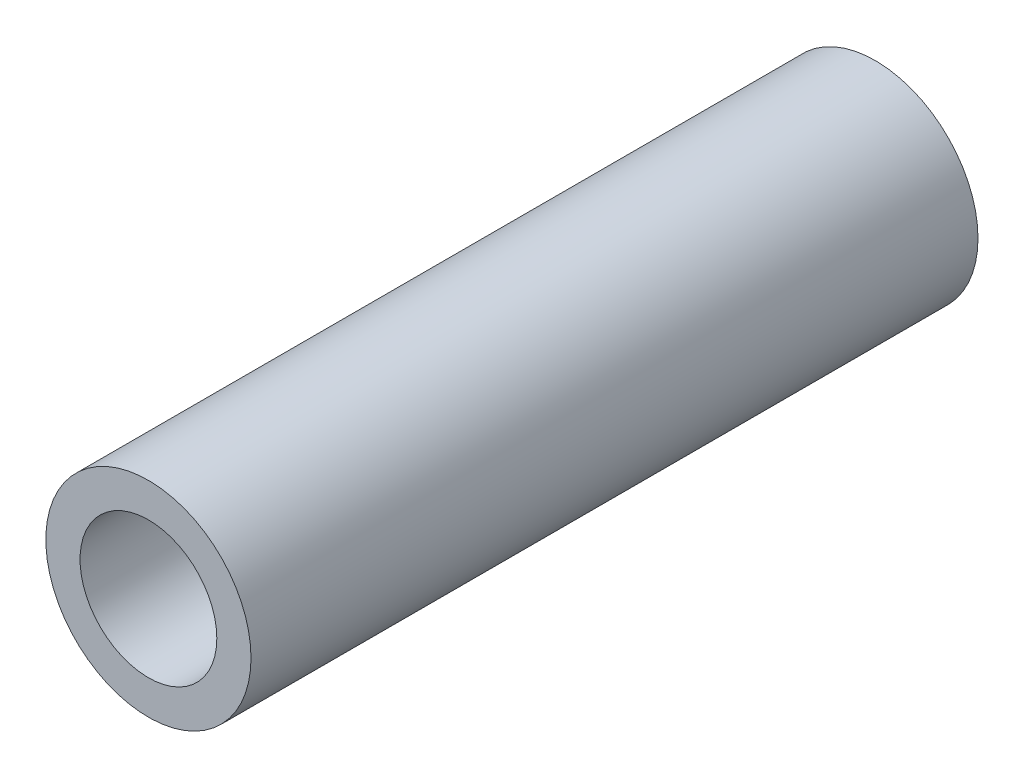
ISO-10303-21;
HEADER;
FILE_DESCRIPTION(('STEP AP214'),'2;1');
FILE_NAME('part.step','',(''),(''),'','','');
FILE_SCHEMA(('AUTOMOTIVE_DESIGN { 1 0 10303 214 1 1 1 1 }'));
ENDSEC;
DATA;
#1=APPLICATION_CONTEXT('core data for automotive mechanical design processes');
#2=APPLICATION_PROTOCOL_DEFINITION('international standard','automotive_design',2000,#1);
#3=PRODUCT_CONTEXT('',#1,'mechanical');
#4=PRODUCT('Part','Part','',(#3));
#5=PRODUCT_RELATED_PRODUCT_CATEGORY('part','',(#4));
#6=PRODUCT_DEFINITION_FORMATION('','',#4);
#7=PRODUCT_DEFINITION_CONTEXT('part definition',#1,'design');
#8=PRODUCT_DEFINITION('design','',#6,#7);
#9=PRODUCT_DEFINITION_SHAPE('','',#8);
#10=(LENGTH_UNIT() NAMED_UNIT(*) SI_UNIT(.MILLI.,.METRE.));
#11=(NAMED_UNIT(*) PLANE_ANGLE_UNIT() SI_UNIT($,.RADIAN.));
#12=(NAMED_UNIT(*) SI_UNIT($,.STERADIAN.) SOLID_ANGLE_UNIT());
#13=UNCERTAINTY_MEASURE_WITH_UNIT(LENGTH_MEASURE(1.E-05),#10,'distance_accuracy_value','');
#14=(GEOMETRIC_REPRESENTATION_CONTEXT(3) GLOBAL_UNCERTAINTY_ASSIGNED_CONTEXT((#13)) GLOBAL_UNIT_ASSIGNED_CONTEXT((#10,
#11,#12)) REPRESENTATION_CONTEXT('',''));
#15=CARTESIAN_POINT('',(0.,0.,0.));
#16=DIRECTION('',(0.,0.,1.));
#17=DIRECTION('',(1.,0.,0.));
#18=AXIS2_PLACEMENT_3D('',#15,#16,#17);
#19=CARTESIAN_POINT('',(0.,0.,53.15));
#20=DIRECTION('',(0.,0.,1.));
#21=DIRECTION('',(1.,0.,0.));
#22=AXIS2_PLACEMENT_3D('',#19,#20,#21);
#23=PLANE('',#22);
#24=CARTESIAN_POINT('',(0.,0.,53.15));
#25=DIRECTION('',(0.,0.,1.));
#26=DIRECTION('',(1.,0.,0.));
#27=AXIS2_PLACEMENT_3D('',#24,#25,#26);
#28=CIRCLE('',#27,15.);
#29=CARTESIAN_POINT('',(15.,0.,53.15));
#30=VERTEX_POINT('',#29);
#31=EDGE_CURVE('E10',#30,#30,#28,.T.);
#32=ORIENTED_EDGE('',*,*,#31,.T.);
#33=EDGE_LOOP('',(#32));
#34=FACE_BOUND('',#33,.T.);
#35=CARTESIAN_POINT('',(0.,0.,53.15));
#36=DIRECTION('',(0.,0.,1.));
#37=DIRECTION('',(1.,0.,0.));
#38=AXIS2_PLACEMENT_3D('',#35,#36,#37);
#39=CIRCLE('',#38,10.);
#40=CARTESIAN_POINT('',(10.,0.,53.15));
#41=VERTEX_POINT('',#40);
#42=EDGE_CURVE('E54',#41,#41,#39,.T.);
#43=ORIENTED_EDGE('',*,*,#42,.F.);
#44=EDGE_LOOP('',(#43));
#45=FACE_BOUND('',#44,.T.);
#46=ADVANCED_FACE('F41',(#34,#45),#23,.T.);
#47=CARTESIAN_POINT('',(0.,0.,-53.15));
#48=DIRECTION('',(0.,0.,1.));
#49=DIRECTION('',(1.,0.,0.));
#50=AXIS2_PLACEMENT_3D('',#47,#48,#49);
#51=PLANE('',#50);
#52=CARTESIAN_POINT('',(0.,0.,-53.15));
#53=DIRECTION('',(0.,0.,1.));
#54=DIRECTION('',(1.,0.,0.));
#55=AXIS2_PLACEMENT_3D('',#52,#53,#54);
#56=CIRCLE('',#55,15.);
#57=CARTESIAN_POINT('',(15.,0.,-53.15));
#58=VERTEX_POINT('',#57);
#59=EDGE_CURVE('E45',#58,#58,#56,.T.);
#60=ORIENTED_EDGE('',*,*,#59,.F.);
#61=EDGE_LOOP('',(#60));
#62=FACE_BOUND('',#61,.T.);
#63=CARTESIAN_POINT('',(0.,0.,-53.15));
#64=DIRECTION('',(0.,0.,1.));
#65=DIRECTION('',(1.,0.,0.));
#66=AXIS2_PLACEMENT_3D('',#63,#64,#65);
#67=CIRCLE('',#66,10.);
#68=CARTESIAN_POINT('',(10.,0.,-53.15));
#69=VERTEX_POINT('',#68);
#70=EDGE_CURVE('E56',#69,#69,#67,.T.);
#71=ORIENTED_EDGE('',*,*,#70,.T.);
#72=EDGE_LOOP('',(#71));
#73=FACE_BOUND('',#72,.T.);
#74=ADVANCED_FACE('F68',(#62,#73),#51,.F.);
#75=CARTESIAN_POINT('',(0.,0.,53.15));
#76=DIRECTION('',(0.,0.,-1.));
#77=DIRECTION('',(-1.,0.,0.));
#78=AXIS2_PLACEMENT_3D('',#75,#76,#77);
#79=CYLINDRICAL_SURFACE('',#78,15.);
#80=ORIENTED_EDGE('',*,*,#31,.F.);
#81=EDGE_LOOP('',(#80));
#82=FACE_BOUND('',#81,.T.);
#83=ORIENTED_EDGE('',*,*,#59,.T.);
#84=EDGE_LOOP('',(#83));
#85=FACE_BOUND('',#84,.T.);
#86=ADVANCED_FACE('F43',(#82,#85),#79,.T.);
#87=CARTESIAN_POINT('',(0.,0.,53.15));
#88=DIRECTION('',(0.,0.,-1.));
#89=DIRECTION('',(-1.,0.,0.));
#90=AXIS2_PLACEMENT_3D('',#87,#88,#89);
#91=CYLINDRICAL_SURFACE('',#90,10.);
#92=ORIENTED_EDGE('',*,*,#42,.T.);
#93=EDGE_LOOP('',(#92));
#94=FACE_BOUND('',#93,.T.);
#95=ORIENTED_EDGE('',*,*,#70,.F.);
#96=EDGE_LOOP('',(#95));
#97=FACE_BOUND('',#96,.T.);
#98=ADVANCED_FACE('F64',(#94,#97),#91,.F.);
#99=CLOSED_SHELL('',(#46,#74,#86,#98));
#100=MANIFOLD_SOLID_BREP('B2',#99);
#101=ADVANCED_BREP_SHAPE_REPRESENTATION('',(#18,#100),#14);
#102=SHAPE_DEFINITION_REPRESENTATION(#9,#101);
ENDSEC;
END-ISO-10303-21;
